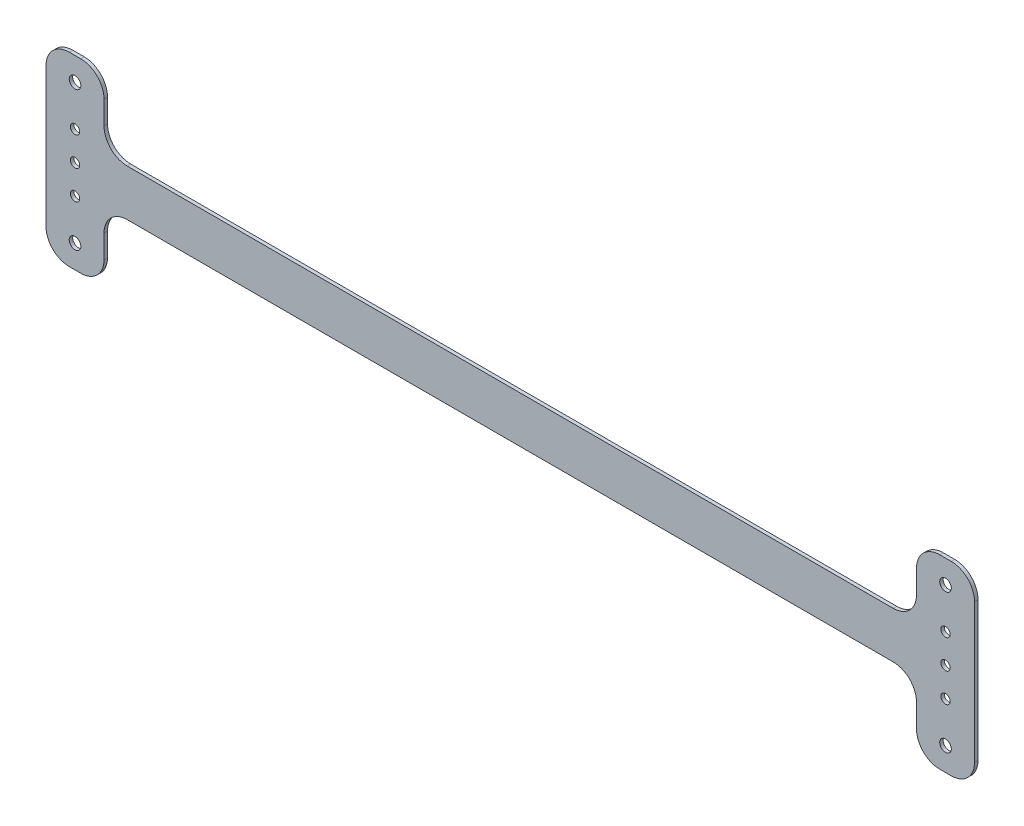
ISO-10303-21;
HEADER;
FILE_DESCRIPTION(('STEP AP214'),'2;1');
FILE_NAME('part.step','',(''),(''),'','','');
FILE_SCHEMA(('AUTOMOTIVE_DESIGN { 1 0 10303 214 1 1 1 1 }'));
ENDSEC;
DATA;
#1=APPLICATION_CONTEXT('core data for automotive mechanical design processes');
#2=APPLICATION_PROTOCOL_DEFINITION('international standard','automotive_design',2000,#1);
#3=PRODUCT_CONTEXT('',#1,'mechanical');
#4=PRODUCT('Part','Part','',(#3));
#5=PRODUCT_RELATED_PRODUCT_CATEGORY('part','',(#4));
#6=PRODUCT_DEFINITION_FORMATION('','',#4);
#7=PRODUCT_DEFINITION_CONTEXT('part definition',#1,'design');
#8=PRODUCT_DEFINITION('design','',#6,#7);
#9=PRODUCT_DEFINITION_SHAPE('','',#8);
#10=(LENGTH_UNIT() NAMED_UNIT(*) SI_UNIT(.MILLI.,.METRE.));
#11=(NAMED_UNIT(*) PLANE_ANGLE_UNIT() SI_UNIT($,.RADIAN.));
#12=(NAMED_UNIT(*) SI_UNIT($,.STERADIAN.) SOLID_ANGLE_UNIT());
#13=UNCERTAINTY_MEASURE_WITH_UNIT(LENGTH_MEASURE(1.E-05),#10,'distance_accuracy_value','');
#14=(GEOMETRIC_REPRESENTATION_CONTEXT(3) GLOBAL_UNCERTAINTY_ASSIGNED_CONTEXT((#13)) GLOBAL_UNIT_ASSIGNED_CONTEXT((#10,
#11,#12)) REPRESENTATION_CONTEXT('',''));
#15=CARTESIAN_POINT('',(0.,0.,0.));
#16=DIRECTION('',(0.,0.,1.));
#17=DIRECTION('',(1.,0.,0.));
#18=AXIS2_PLACEMENT_3D('',#15,#16,#17);
#19=CARTESIAN_POINT('',(0.,0.,3.));
#20=DIRECTION('',(0.,0.,1.));
#21=DIRECTION('',(1.,0.,0.));
#22=AXIS2_PLACEMENT_3D('',#19,#20,#21);
#23=PLANE('',#22);
#24=CARTESIAN_POINT('',(-24.9999999999991,-5.00000000000001,3.));
#25=DIRECTION('',(0.,0.,1.));
#26=DIRECTION('',(1.,0.,0.));
#27=AXIS2_PLACEMENT_3D('',#24,#25,#26);
#28=CIRCLE('',#27,4.00000000000001);
#29=CARTESIAN_POINT('',(-20.9999999999991,-5.00000000000001,3.));
#30=VERTEX_POINT('',#29);
#31=EDGE_CURVE('E460',#30,#30,#28,.T.);
#32=ORIENTED_EDGE('',*,*,#31,.F.);
#33=EDGE_LOOP('',(#32));
#34=FACE_BOUND('',#33,.T.);
#35=CARTESIAN_POINT('',(-24.9999999999991,45.,3.));
#36=DIRECTION('',(0.,0.,1.));
#37=DIRECTION('',(1.,0.,0.));
#38=AXIS2_PLACEMENT_3D('',#35,#36,#37);
#39=CIRCLE('',#38,3.99999999999998);
#40=CARTESIAN_POINT('',(-20.9999999999991,45.,3.));
#41=VERTEX_POINT('',#40);
#42=EDGE_CURVE('E693',#41,#41,#39,.T.);
#43=ORIENTED_EDGE('',*,*,#42,.F.);
#44=EDGE_LOOP('',(#43));
#45=FACE_BOUND('',#44,.T.);
#46=CARTESIAN_POINT('',(724.999999999999,20.0000000000001,3.));
#47=DIRECTION('',(0.,0.,-1.));
#48=DIRECTION('',(-1.,0.,0.));
#49=AXIS2_PLACEMENT_3D('',#46,#47,#48);
#50=CIRCLE('',#49,3.99999999999999);
#51=CARTESIAN_POINT('',(720.999999999999,20.0000000000001,3.));
#52=VERTEX_POINT('',#51);
#53=EDGE_CURVE('E447',#52,#52,#50,.T.);
#54=ORIENTED_EDGE('',*,*,#53,.T.);
#55=EDGE_LOOP('',(#54));
#56=FACE_BOUND('',#55,.T.);
#57=CARTESIAN_POINT('',(725.,80.,3.));
#58=DIRECTION('',(0.,0.,1.));
#59=DIRECTION('',(1.,0.,0.));
#60=AXIS2_PLACEMENT_3D('',#57,#58,#59);
#61=CIRCLE('',#60,5.00000000000005);
#62=CARTESIAN_POINT('',(730.,80.,3.));
#63=VERTEX_POINT('',#62);
#64=EDGE_CURVE('E240',#63,#63,#61,.F.);
#65=ORIENTED_EDGE('',*,*,#64,.T.);
#66=EDGE_LOOP('',(#65));
#67=FACE_BOUND('',#66,.T.);
#68=CARTESIAN_POINT('',(725.,-40.,3.));
#69=DIRECTION('',(0.,0.,1.));
#70=DIRECTION('',(1.,0.,0.));
#71=AXIS2_PLACEMENT_3D('',#68,#69,#70);
#72=CIRCLE('',#71,5.00000000000005);
#73=CARTESIAN_POINT('',(730.,-40.,3.));
#74=VERTEX_POINT('',#73);
#75=EDGE_CURVE('E414',#74,#74,#72,.T.);
#76=ORIENTED_EDGE('',*,*,#75,.F.);
#77=EDGE_LOOP('',(#76));
#78=FACE_BOUND('',#77,.T.);
#79=CARTESIAN_POINT('',(-24.9999999999991,-40.,3.));
#80=DIRECTION('',(0.,0.,1.));
#81=DIRECTION('',(1.,0.,0.));
#82=AXIS2_PLACEMENT_3D('',#79,#80,#81);
#83=CIRCLE('',#82,5.00000000000001);
#84=CARTESIAN_POINT('',(-19.9999999999991,-40.,3.));
#85=VERTEX_POINT('',#84);
#86=EDGE_CURVE('E407',#85,#85,#83,.F.);
#87=ORIENTED_EDGE('',*,*,#86,.T.);
#88=EDGE_LOOP('',(#87));
#89=FACE_BOUND('',#88,.T.);
#90=CARTESIAN_POINT('',(-24.9999999999991,80.,3.));
#91=DIRECTION('',(0.,0.,1.));
#92=DIRECTION('',(1.,0.,0.));
#93=AXIS2_PLACEMENT_3D('',#90,#91,#92);
#94=CIRCLE('',#93,5.00000000000001);
#95=CARTESIAN_POINT('',(-19.9999999999991,80.,3.));
#96=VERTEX_POINT('',#95);
#97=EDGE_CURVE('E401',#96,#96,#94,.T.);
#98=ORIENTED_EDGE('',*,*,#97,.F.);
#99=EDGE_LOOP('',(#98));
#100=FACE_BOUND('',#99,.T.);
#101=DIRECTION('',(0.,-1.,0.));
#102=VECTOR('',#101,1.);
#103=CARTESIAN_POINT('',(700.,9.71445146547012E-13,3.));
#104=LINE('',#103,#102);
#105=CARTESIAN_POINT('',(700.,-20.,3.));
#106=VERTEX_POINT('',#105);
#107=CARTESIAN_POINT('',(700.,-40.,3.));
#108=VERTEX_POINT('',#107);
#109=EDGE_CURVE('E462',#106,#108,#104,.T.);
#110=ORIENTED_EDGE('',*,*,#109,.T.);
#111=CARTESIAN_POINT('',(720.,-40.,3.));
#112=DIRECTION('',(0.,0.,1.));
#113=DIRECTION('',(1.,0.,0.));
#114=AXIS2_PLACEMENT_3D('',#111,#112,#113);
#115=CIRCLE('',#114,20.);
#116=CARTESIAN_POINT('',(720.,-60.,3.));
#117=VERTEX_POINT('',#116);
#118=EDGE_CURVE('E338',#108,#117,#115,.T.);
#119=ORIENTED_EDGE('',*,*,#118,.T.);
#120=DIRECTION('',(1.,0.,0.));
#121=VECTOR('',#120,1.);
#122=CARTESIAN_POINT('',(0.,-60.,3.));
#123=LINE('',#122,#121);
#124=CARTESIAN_POINT('',(730.,-60.,3.));
#125=VERTEX_POINT('',#124);
#126=EDGE_CURVE('E466',#117,#125,#123,.T.);
#127=ORIENTED_EDGE('',*,*,#126,.T.);
#128=CARTESIAN_POINT('',(730.,-40.,3.));
#129=DIRECTION('',(0.,0.,1.));
#130=DIRECTION('',(1.,0.,0.));
#131=AXIS2_PLACEMENT_3D('',#128,#129,#130);
#132=CIRCLE('',#131,20.);
#133=CARTESIAN_POINT('',(750.,-40.,3.));
#134=VERTEX_POINT('',#133);
#135=EDGE_CURVE('E336',#125,#134,#132,.T.);
#136=ORIENTED_EDGE('',*,*,#135,.T.);
#137=DIRECTION('',(0.,-1.,0.));
#138=VECTOR('',#137,1.);
#139=CARTESIAN_POINT('',(750.,-5.20417042793042E-13,3.));
#140=LINE('',#139,#138);
#141=CARTESIAN_POINT('',(750.,80.,3.));
#142=VERTEX_POINT('',#141);
#143=EDGE_CURVE('E469',#142,#134,#140,.T.);
#144=ORIENTED_EDGE('',*,*,#143,.F.);
#145=CARTESIAN_POINT('',(730.,80.,3.));
#146=DIRECTION('',(0.,0.,1.));
#147=DIRECTION('',(1.,0.,0.));
#148=AXIS2_PLACEMENT_3D('',#145,#146,#147);
#149=CIRCLE('',#148,20.);
#150=CARTESIAN_POINT('',(730.,100.,3.));
#151=VERTEX_POINT('',#150);
#152=EDGE_CURVE('E334',#142,#151,#149,.T.);
#153=ORIENTED_EDGE('',*,*,#152,.T.);
#154=DIRECTION('',(1.,0.,0.));
#155=VECTOR('',#154,1.);
#156=CARTESIAN_POINT('',(0.,100.,3.));
#157=LINE('',#156,#155);
#158=CARTESIAN_POINT('',(720.,100.,3.));
#159=VERTEX_POINT('',#158);
#160=EDGE_CURVE('E465',#159,#151,#157,.T.);
#161=ORIENTED_EDGE('',*,*,#160,.F.);
#162=CARTESIAN_POINT('',(720.,80.,3.));
#163=DIRECTION('',(0.,0.,1.));
#164=DIRECTION('',(1.,0.,0.));
#165=AXIS2_PLACEMENT_3D('',#162,#163,#164);
#166=CIRCLE('',#165,20.);
#167=CARTESIAN_POINT('',(700.,80.,3.));
#168=VERTEX_POINT('',#167);
#169=EDGE_CURVE('E332',#159,#168,#166,.T.);
#170=ORIENTED_EDGE('',*,*,#169,.T.);
#171=CARTESIAN_POINT('',(700.,60.,3.));
#172=VERTEX_POINT('',#171);
#173=EDGE_CURVE('E398',#168,#172,#104,.T.);
#174=ORIENTED_EDGE('',*,*,#173,.T.);
#175=CARTESIAN_POINT('',(680.,60.,3.));
#176=DIRECTION('',(0.,0.,1.));
#177=DIRECTION('',(1.,0.,0.));
#178=AXIS2_PLACEMENT_3D('',#175,#176,#177);
#179=CIRCLE('',#178,20.);
#180=CARTESIAN_POINT('',(680.,40.,3.));
#181=VERTEX_POINT('',#180);
#182=EDGE_CURVE('E369',#172,#181,#179,.F.);
#183=ORIENTED_EDGE('',*,*,#182,.T.);
#184=DIRECTION('',(1.,0.,0.));
#185=VECTOR('',#184,1.);
#186=CARTESIAN_POINT('',(0.,40.,3.));
#187=LINE('',#186,#185);
#188=CARTESIAN_POINT('',(20.,40.,3.));
#189=VERTEX_POINT('',#188);
#190=EDGE_CURVE('E388',#189,#181,#187,.T.);
#191=ORIENTED_EDGE('',*,*,#190,.F.);
#192=CARTESIAN_POINT('',(20.,60.,3.));
#193=DIRECTION('',(0.,0.,1.));
#194=DIRECTION('',(1.,0.,0.));
#195=AXIS2_PLACEMENT_3D('',#192,#193,#194);
#196=CIRCLE('',#195,20.);
#197=CARTESIAN_POINT('',(0.,60.,3.));
#198=VERTEX_POINT('',#197);
#199=EDGE_CURVE('E11',#189,#198,#196,.F.);
#200=ORIENTED_EDGE('',*,*,#199,.T.);
#201=DIRECTION('',(0.,-1.,0.));
#202=VECTOR('',#201,1.);
#203=CARTESIAN_POINT('',(0.,0.,3.));
#204=LINE('',#203,#202);
#205=CARTESIAN_POINT('',(0.,80.,3.));
#206=VERTEX_POINT('',#205);
#207=EDGE_CURVE('E386',#206,#198,#204,.T.);
#208=ORIENTED_EDGE('',*,*,#207,.F.);
#209=CARTESIAN_POINT('',(-20.,80.,3.));
#210=DIRECTION('',(0.,0.,1.));
#211=DIRECTION('',(1.,0.,0.));
#212=AXIS2_PLACEMENT_3D('',#209,#210,#211);
#213=CIRCLE('',#212,20.);
#214=CARTESIAN_POINT('',(-20.,100.,3.));
#215=VERTEX_POINT('',#214);
#216=EDGE_CURVE('E325',#206,#215,#213,.T.);
#217=ORIENTED_EDGE('',*,*,#216,.T.);
#218=DIRECTION('',(-1.,0.,0.));
#219=VECTOR('',#218,1.);
#220=CARTESIAN_POINT('',(0.,100.,3.));
#221=LINE('',#220,#219);
#222=CARTESIAN_POINT('',(-29.9999999999993,100.,3.));
#223=VERTEX_POINT('',#222);
#224=EDGE_CURVE('E392',#215,#223,#221,.T.);
#225=ORIENTED_EDGE('',*,*,#224,.T.);
#226=CARTESIAN_POINT('',(-29.9999999999993,80.,3.));
#227=DIRECTION('',(0.,0.,1.));
#228=DIRECTION('',(1.,0.,0.));
#229=AXIS2_PLACEMENT_3D('',#226,#227,#228);
#230=CIRCLE('',#229,20.);
#231=CARTESIAN_POINT('',(-49.9999999999993,80.,3.));
#232=VERTEX_POINT('',#231);
#233=EDGE_CURVE('E327',#223,#232,#230,.T.);
#234=ORIENTED_EDGE('',*,*,#233,.T.);
#235=DIRECTION('',(0.,-1.,0.));
#236=VECTOR('',#235,1.);
#237=CARTESIAN_POINT('',(-49.9999999999993,0.,3.));
#238=LINE('',#237,#236);
#239=CARTESIAN_POINT('',(-49.9999999999992,-40.,3.));
#240=VERTEX_POINT('',#239);
#241=EDGE_CURVE('E396',#232,#240,#238,.T.);
#242=ORIENTED_EDGE('',*,*,#241,.T.);
#243=CARTESIAN_POINT('',(-29.9999999999992,-40.,3.));
#244=DIRECTION('',(0.,0.,1.));
#245=DIRECTION('',(1.,0.,0.));
#246=AXIS2_PLACEMENT_3D('',#243,#244,#245);
#247=CIRCLE('',#246,20.);
#248=CARTESIAN_POINT('',(-29.9999999999992,-60.,3.));
#249=VERTEX_POINT('',#248);
#250=EDGE_CURVE('E53',#240,#249,#247,.T.);
#251=ORIENTED_EDGE('',*,*,#250,.T.);
#252=DIRECTION('',(-1.,0.,0.));
#253=VECTOR('',#252,1.);
#254=CARTESIAN_POINT('',(0.,-60.,3.));
#255=LINE('',#254,#253);
#256=CARTESIAN_POINT('',(-20.,-60.,3.));
#257=VERTEX_POINT('',#256);
#258=EDGE_CURVE('E402',#257,#249,#255,.T.);
#259=ORIENTED_EDGE('',*,*,#258,.F.);
#260=CARTESIAN_POINT('',(-20.,-40.,3.));
#261=DIRECTION('',(0.,0.,1.));
#262=DIRECTION('',(1.,0.,0.));
#263=AXIS2_PLACEMENT_3D('',#260,#261,#262);
#264=CIRCLE('',#263,20.);
#265=CARTESIAN_POINT('',(0.,-40.,3.));
#266=VERTEX_POINT('',#265);
#267=EDGE_CURVE('E329',#257,#266,#264,.T.);
#268=ORIENTED_EDGE('',*,*,#267,.T.);
#269=CARTESIAN_POINT('',(0.,-20.,3.));
#270=VERTEX_POINT('',#269);
#271=EDGE_CURVE('E394',#270,#266,#204,.T.);
#272=ORIENTED_EDGE('',*,*,#271,.F.);
#273=CARTESIAN_POINT('',(20.,-20.,3.));
#274=DIRECTION('',(0.,0.,1.));
#275=DIRECTION('',(1.,0.,0.));
#276=AXIS2_PLACEMENT_3D('',#273,#274,#275);
#277=CIRCLE('',#276,20.);
#278=CARTESIAN_POINT('',(20.,0.,3.));
#279=VERTEX_POINT('',#278);
#280=EDGE_CURVE('E210',#270,#279,#277,.F.);
#281=ORIENTED_EDGE('',*,*,#280,.T.);
#282=DIRECTION('',(1.,0.,0.));
#283=VECTOR('',#282,1.);
#284=CARTESIAN_POINT('',(0.,0.,3.));
#285=LINE('',#284,#283);
#286=CARTESIAN_POINT('',(680.,0.,3.));
#287=VERTEX_POINT('',#286);
#288=EDGE_CURVE('E220',#279,#287,#285,.T.);
#289=ORIENTED_EDGE('',*,*,#288,.T.);
#290=CARTESIAN_POINT('',(680.,-20.,3.));
#291=DIRECTION('',(0.,0.,1.));
#292=DIRECTION('',(1.,0.,0.));
#293=AXIS2_PLACEMENT_3D('',#290,#291,#292);
#294=CIRCLE('',#293,20.);
#295=EDGE_CURVE('E365',#287,#106,#294,.F.);
#296=ORIENTED_EDGE('',*,*,#295,.T.);
#297=EDGE_LOOP('',(#110,#119,#127,#136,#144,#153,#161,#170,#174,#183,#191,#200,#208,#217,#225,
#234,#242,#251,#259,#268,#272,#281,#289,#296));
#298=FACE_BOUND('',#297,.T.);
#299=CARTESIAN_POINT('',(-24.9999999999991,20.,3.));
#300=DIRECTION('',(0.,0.,1.));
#301=DIRECTION('',(1.,0.,0.));
#302=AXIS2_PLACEMENT_3D('',#299,#300,#301);
#303=CIRCLE('',#302,4.00000000000003);
#304=CARTESIAN_POINT('',(-20.9999999999991,20.,3.));
#305=VERTEX_POINT('',#304);
#306=EDGE_CURVE('E237',#305,#305,#303,.T.);
#307=ORIENTED_EDGE('',*,*,#306,.F.);
#308=EDGE_LOOP('',(#307));
#309=FACE_BOUND('',#308,.T.);
#310=CARTESIAN_POINT('',(724.999999999999,-5.,3.));
#311=DIRECTION('',(0.,0.,-1.));
#312=DIRECTION('',(-1.,0.,0.));
#313=AXIS2_PLACEMENT_3D('',#310,#311,#312);
#314=CIRCLE('',#313,3.99999999999999);
#315=CARTESIAN_POINT('',(720.999999999999,-5.,3.));
#316=VERTEX_POINT('',#315);
#317=EDGE_CURVE('E456',#316,#316,#314,.T.);
#318=ORIENTED_EDGE('',*,*,#317,.T.);
#319=EDGE_LOOP('',(#318));
#320=FACE_BOUND('',#319,.T.);
#321=CARTESIAN_POINT('',(724.999999999999,45.,3.));
#322=DIRECTION('',(0.,0.,-1.));
#323=DIRECTION('',(-1.,0.,0.));
#324=AXIS2_PLACEMENT_3D('',#321,#322,#323);
#325=CIRCLE('',#324,3.99999999999988);
#326=CARTESIAN_POINT('',(720.999999999999,45.,3.));
#327=VERTEX_POINT('',#326);
#328=EDGE_CURVE('E446',#327,#327,#325,.T.);
#329=ORIENTED_EDGE('',*,*,#328,.T.);
#330=EDGE_LOOP('',(#329));
#331=FACE_BOUND('',#330,.T.);
#332=ADVANCED_FACE('F38',(#34,#45,#56,#67,#78,#89,#100,#298,#309,#320,#331),#23,.T.);
#333=CARTESIAN_POINT('',(0.,0.,0.));
#334=DIRECTION('',(0.,0.,1.));
#335=DIRECTION('',(1.,0.,0.));
#336=AXIS2_PLACEMENT_3D('',#333,#334,#335);
#337=PLANE('',#336);
#338=CARTESIAN_POINT('',(-24.9999999999991,-5.00000000000001,0.));
#339=DIRECTION('',(0.,0.,1.));
#340=DIRECTION('',(1.,0.,0.));
#341=AXIS2_PLACEMENT_3D('',#338,#339,#340);
#342=CIRCLE('',#341,4.00000000000001);
#343=CARTESIAN_POINT('',(-20.9999999999991,-5.00000000000001,0.));
#344=VERTEX_POINT('',#343);
#345=EDGE_CURVE('E690',#344,#344,#342,.T.);
#346=ORIENTED_EDGE('',*,*,#345,.T.);
#347=EDGE_LOOP('',(#346));
#348=FACE_BOUND('',#347,.T.);
#349=CARTESIAN_POINT('',(-24.9999999999991,45.,0.));
#350=DIRECTION('',(0.,0.,1.));
#351=DIRECTION('',(1.,0.,0.));
#352=AXIS2_PLACEMENT_3D('',#349,#350,#351);
#353=CIRCLE('',#352,3.99999999999998);
#354=CARTESIAN_POINT('',(-20.9999999999991,45.,0.));
#355=VERTEX_POINT('',#354);
#356=EDGE_CURVE('E450',#355,#355,#353,.T.);
#357=ORIENTED_EDGE('',*,*,#356,.T.);
#358=EDGE_LOOP('',(#357));
#359=FACE_BOUND('',#358,.T.);
#360=CARTESIAN_POINT('',(-24.9999999999991,20.,0.));
#361=DIRECTION('',(0.,0.,1.));
#362=DIRECTION('',(1.,0.,0.));
#363=AXIS2_PLACEMENT_3D('',#360,#361,#362);
#364=CIRCLE('',#363,4.00000000000003);
#365=CARTESIAN_POINT('',(-20.9999999999991,20.,0.));
#366=VERTEX_POINT('',#365);
#367=EDGE_CURVE('E230',#366,#366,#364,.T.);
#368=ORIENTED_EDGE('',*,*,#367,.T.);
#369=EDGE_LOOP('',(#368));
#370=FACE_BOUND('',#369,.T.);
#371=DIRECTION('',(1.,0.,0.));
#372=VECTOR('',#371,1.);
#373=CARTESIAN_POINT('',(0.,-60.,0.));
#374=LINE('',#373,#372);
#375=CARTESIAN_POINT('',(720.,-60.,0.));
#376=VERTEX_POINT('',#375);
#377=CARTESIAN_POINT('',(730.,-60.,0.));
#378=VERTEX_POINT('',#377);
#379=EDGE_CURVE('E233',#376,#378,#374,.T.);
#380=ORIENTED_EDGE('',*,*,#379,.F.);
#381=CARTESIAN_POINT('',(720.,-40.,0.));
#382=DIRECTION('',(0.,0.,1.));
#383=DIRECTION('',(1.,0.,0.));
#384=AXIS2_PLACEMENT_3D('',#381,#382,#383);
#385=CIRCLE('',#384,20.);
#386=CARTESIAN_POINT('',(700.,-40.,0.));
#387=VERTEX_POINT('',#386);
#388=EDGE_CURVE('E323',#376,#387,#385,.F.);
#389=ORIENTED_EDGE('',*,*,#388,.T.);
#390=DIRECTION('',(0.,-1.,0.));
#391=VECTOR('',#390,1.);
#392=CARTESIAN_POINT('',(700.,9.71445146547012E-13,0.));
#393=LINE('',#392,#391);
#394=CARTESIAN_POINT('',(700.,-20.,0.));
#395=VERTEX_POINT('',#394);
#396=EDGE_CURVE('E229',#395,#387,#393,.T.);
#397=ORIENTED_EDGE('',*,*,#396,.F.);
#398=CARTESIAN_POINT('',(680.,-20.,0.));
#399=DIRECTION('',(0.,0.,1.));
#400=DIRECTION('',(1.,0.,0.));
#401=AXIS2_PLACEMENT_3D('',#398,#399,#400);
#402=CIRCLE('',#401,20.);
#403=CARTESIAN_POINT('',(680.,0.,0.));
#404=VERTEX_POINT('',#403);
#405=EDGE_CURVE('E228',#395,#404,#402,.T.);
#406=ORIENTED_EDGE('',*,*,#405,.T.);
#407=DIRECTION('',(1.,0.,0.));
#408=VECTOR('',#407,1.);
#409=CARTESIAN_POINT('',(0.,0.,0.));
#410=LINE('',#409,#408);
#411=CARTESIAN_POINT('',(20.,0.,0.));
#412=VERTEX_POINT('',#411);
#413=EDGE_CURVE('E217',#412,#404,#410,.T.);
#414=ORIENTED_EDGE('',*,*,#413,.F.);
#415=CARTESIAN_POINT('',(20.,-20.,0.));
#416=DIRECTION('',(0.,0.,1.));
#417=DIRECTION('',(1.,0.,0.));
#418=AXIS2_PLACEMENT_3D('',#415,#416,#417);
#419=CIRCLE('',#418,20.);
#420=CARTESIAN_POINT('',(0.,-20.,0.));
#421=VERTEX_POINT('',#420);
#422=EDGE_CURVE('E200',#412,#421,#419,.T.);
#423=ORIENTED_EDGE('',*,*,#422,.T.);
#424=DIRECTION('',(0.,-1.,0.));
#425=VECTOR('',#424,1.);
#426=CARTESIAN_POINT('',(0.,0.,0.));
#427=LINE('',#426,#425);
#428=CARTESIAN_POINT('',(0.,-40.,0.));
#429=VERTEX_POINT('',#428);
#430=EDGE_CURVE('E259',#421,#429,#427,.T.);
#431=ORIENTED_EDGE('',*,*,#430,.T.);
#432=CARTESIAN_POINT('',(-20.,-40.,0.));
#433=DIRECTION('',(0.,0.,1.));
#434=DIRECTION('',(1.,0.,0.));
#435=AXIS2_PLACEMENT_3D('',#432,#433,#434);
#436=CIRCLE('',#435,20.);
#437=CARTESIAN_POINT('',(-20.,-60.,0.));
#438=VERTEX_POINT('',#437);
#439=EDGE_CURVE('E313',#429,#438,#436,.F.);
#440=ORIENTED_EDGE('',*,*,#439,.T.);
#441=DIRECTION('',(-1.,0.,0.));
#442=VECTOR('',#441,1.);
#443=CARTESIAN_POINT('',(0.,-60.,0.));
#444=LINE('',#443,#442);
#445=CARTESIAN_POINT('',(-29.9999999999992,-60.,0.));
#446=VERTEX_POINT('',#445);
#447=EDGE_CURVE('E265',#438,#446,#444,.T.);
#448=ORIENTED_EDGE('',*,*,#447,.T.);
#449=CARTESIAN_POINT('',(-29.9999999999992,-40.,0.));
#450=DIRECTION('',(0.,0.,1.));
#451=DIRECTION('',(1.,0.,0.));
#452=AXIS2_PLACEMENT_3D('',#449,#450,#451);
#453=CIRCLE('',#452,20.);
#454=CARTESIAN_POINT('',(-49.9999999999992,-40.,0.));
#455=VERTEX_POINT('',#454);
#456=EDGE_CURVE('E315',#446,#455,#453,.F.);
#457=ORIENTED_EDGE('',*,*,#456,.T.);
#458=DIRECTION('',(0.,-1.,0.));
#459=VECTOR('',#458,1.);
#460=CARTESIAN_POINT('',(-49.9999999999993,0.,0.));
#461=LINE('',#460,#459);
#462=CARTESIAN_POINT('',(-49.9999999999993,80.,0.));
#463=VERTEX_POINT('',#462);
#464=EDGE_CURVE('E262',#463,#455,#461,.T.);
#465=ORIENTED_EDGE('',*,*,#464,.F.);
#466=CARTESIAN_POINT('',(-29.9999999999993,80.,0.));
#467=DIRECTION('',(0.,0.,1.));
#468=DIRECTION('',(1.,0.,0.));
#469=AXIS2_PLACEMENT_3D('',#466,#467,#468);
#470=CIRCLE('',#469,20.);
#471=CARTESIAN_POINT('',(-29.9999999999993,100.,0.));
#472=VERTEX_POINT('',#471);
#473=EDGE_CURVE('E311',#463,#472,#470,.F.);
#474=ORIENTED_EDGE('',*,*,#473,.T.);
#475=DIRECTION('',(-1.,0.,0.));
#476=VECTOR('',#475,1.);
#477=CARTESIAN_POINT('',(0.,100.,0.));
#478=LINE('',#477,#476);
#479=CARTESIAN_POINT('',(-20.,100.,0.));
#480=VERTEX_POINT('',#479);
#481=EDGE_CURVE('E258',#480,#472,#478,.T.);
#482=ORIENTED_EDGE('',*,*,#481,.F.);
#483=CARTESIAN_POINT('',(-20.,80.,0.));
#484=DIRECTION('',(0.,0.,1.));
#485=DIRECTION('',(1.,0.,0.));
#486=AXIS2_PLACEMENT_3D('',#483,#484,#485);
#487=CIRCLE('',#486,20.);
#488=CARTESIAN_POINT('',(0.,80.,0.));
#489=VERTEX_POINT('',#488);
#490=EDGE_CURVE('E309',#480,#489,#487,.F.);
#491=ORIENTED_EDGE('',*,*,#490,.T.);
#492=CARTESIAN_POINT('',(0.,60.,0.));
#493=VERTEX_POINT('',#492);
#494=EDGE_CURVE('E255',#489,#493,#427,.T.);
#495=ORIENTED_EDGE('',*,*,#494,.T.);
#496=CARTESIAN_POINT('',(20.,60.,0.));
#497=DIRECTION('',(0.,0.,1.));
#498=DIRECTION('',(1.,0.,0.));
#499=AXIS2_PLACEMENT_3D('',#496,#497,#498);
#500=CIRCLE('',#499,20.);
#501=CARTESIAN_POINT('',(20.,40.,0.));
#502=VERTEX_POINT('',#501);
#503=EDGE_CURVE('E46',#493,#502,#500,.T.);
#504=ORIENTED_EDGE('',*,*,#503,.T.);
#505=DIRECTION('',(1.,0.,0.));
#506=VECTOR('',#505,1.);
#507=CARTESIAN_POINT('',(0.,40.,0.));
#508=LINE('',#507,#506);
#509=CARTESIAN_POINT('',(680.,40.,0.));
#510=VERTEX_POINT('',#509);
#511=EDGE_CURVE('E244',#502,#510,#508,.T.);
#512=ORIENTED_EDGE('',*,*,#511,.T.);
#513=CARTESIAN_POINT('',(680.,60.,0.));
#514=DIRECTION('',(0.,0.,1.));
#515=DIRECTION('',(1.,0.,0.));
#516=AXIS2_PLACEMENT_3D('',#513,#514,#515);
#517=CIRCLE('',#516,20.);
#518=CARTESIAN_POINT('',(700.,60.,0.));
#519=VERTEX_POINT('',#518);
#520=EDGE_CURVE('E367',#510,#519,#517,.T.);
#521=ORIENTED_EDGE('',*,*,#520,.T.);
#522=CARTESIAN_POINT('',(700.,80.,0.));
#523=VERTEX_POINT('',#522);
#524=EDGE_CURVE('E235',#523,#519,#393,.T.);
#525=ORIENTED_EDGE('',*,*,#524,.F.);
#526=CARTESIAN_POINT('',(720.,80.,0.));
#527=DIRECTION('',(0.,0.,1.));
#528=DIRECTION('',(1.,0.,0.));
#529=AXIS2_PLACEMENT_3D('',#526,#527,#528);
#530=CIRCLE('',#529,20.);
#531=CARTESIAN_POINT('',(720.,100.,0.));
#532=VERTEX_POINT('',#531);
#533=EDGE_CURVE('E317',#523,#532,#530,.F.);
#534=ORIENTED_EDGE('',*,*,#533,.T.);
#535=DIRECTION('',(1.,0.,0.));
#536=VECTOR('',#535,1.);
#537=CARTESIAN_POINT('',(0.,100.,0.));
#538=LINE('',#537,#536);
#539=CARTESIAN_POINT('',(730.,100.,0.));
#540=VERTEX_POINT('',#539);
#541=EDGE_CURVE('E245',#532,#540,#538,.T.);
#542=ORIENTED_EDGE('',*,*,#541,.T.);
#543=CARTESIAN_POINT('',(730.,80.,0.));
#544=DIRECTION('',(0.,0.,1.));
#545=DIRECTION('',(1.,0.,0.));
#546=AXIS2_PLACEMENT_3D('',#543,#544,#545);
#547=CIRCLE('',#546,20.);
#548=CARTESIAN_POINT('',(750.,80.,0.));
#549=VERTEX_POINT('',#548);
#550=EDGE_CURVE('E319',#540,#549,#547,.F.);
#551=ORIENTED_EDGE('',*,*,#550,.T.);
#552=DIRECTION('',(0.,-1.,0.));
#553=VECTOR('',#552,1.);
#554=CARTESIAN_POINT('',(750.,-5.20417042793042E-13,0.));
#555=LINE('',#554,#553);
#556=CARTESIAN_POINT('',(750.,-40.,0.));
#557=VERTEX_POINT('',#556);
#558=EDGE_CURVE('E248',#549,#557,#555,.T.);
#559=ORIENTED_EDGE('',*,*,#558,.T.);
#560=CARTESIAN_POINT('',(730.,-40.,0.));
#561=DIRECTION('',(0.,0.,1.));
#562=DIRECTION('',(1.,0.,0.));
#563=AXIS2_PLACEMENT_3D('',#560,#561,#562);
#564=CIRCLE('',#563,20.);
#565=EDGE_CURVE('E321',#557,#378,#564,.F.);
#566=ORIENTED_EDGE('',*,*,#565,.T.);
#567=EDGE_LOOP('',(#380,#389,#397,#406,#414,#423,#431,#440,#448,#457,#465,#474,#482,#491,#495,
#504,#512,#521,#525,#534,#542,#551,#559,#566));
#568=FACE_BOUND('',#567,.T.);
#569=CARTESIAN_POINT('',(-24.9999999999991,80.,0.));
#570=DIRECTION('',(0.,0.,1.));
#571=DIRECTION('',(1.,0.,0.));
#572=AXIS2_PLACEMENT_3D('',#569,#570,#571);
#573=CIRCLE('',#572,5.00000000000001);
#574=CARTESIAN_POINT('',(-19.9999999999991,80.,0.));
#575=VERTEX_POINT('',#574);
#576=EDGE_CURVE('E268',#575,#575,#573,.T.);
#577=ORIENTED_EDGE('',*,*,#576,.T.);
#578=EDGE_LOOP('',(#577));
#579=FACE_BOUND('',#578,.T.);
#580=CARTESIAN_POINT('',(-24.9999999999991,-40.,0.));
#581=DIRECTION('',(0.,0.,1.));
#582=DIRECTION('',(1.,0.,0.));
#583=AXIS2_PLACEMENT_3D('',#580,#581,#582);
#584=CIRCLE('',#583,5.00000000000001);
#585=CARTESIAN_POINT('',(-19.9999999999991,-40.,0.));
#586=VERTEX_POINT('',#585);
#587=EDGE_CURVE('E271',#586,#586,#584,.F.);
#588=ORIENTED_EDGE('',*,*,#587,.F.);
#589=EDGE_LOOP('',(#588));
#590=FACE_BOUND('',#589,.T.);
#591=CARTESIAN_POINT('',(725.,-40.,0.));
#592=DIRECTION('',(0.,0.,1.));
#593=DIRECTION('',(1.,0.,0.));
#594=AXIS2_PLACEMENT_3D('',#591,#592,#593);
#595=CIRCLE('',#594,5.00000000000005);
#596=CARTESIAN_POINT('',(730.,-40.,0.));
#597=VERTEX_POINT('',#596);
#598=EDGE_CURVE('E274',#597,#597,#595,.T.);
#599=ORIENTED_EDGE('',*,*,#598,.T.);
#600=EDGE_LOOP('',(#599));
#601=FACE_BOUND('',#600,.T.);
#602=CARTESIAN_POINT('',(725.,80.,0.));
#603=DIRECTION('',(0.,0.,1.));
#604=DIRECTION('',(1.,0.,0.));
#605=AXIS2_PLACEMENT_3D('',#602,#603,#604);
#606=CIRCLE('',#605,5.00000000000005);
#607=CARTESIAN_POINT('',(730.,80.,0.));
#608=VERTEX_POINT('',#607);
#609=EDGE_CURVE('E277',#608,#608,#606,.F.);
#610=ORIENTED_EDGE('',*,*,#609,.F.);
#611=EDGE_LOOP('',(#610));
#612=FACE_BOUND('',#611,.T.);
#613=CARTESIAN_POINT('',(724.999999999999,-5.,0.));
#614=DIRECTION('',(0.,0.,-1.));
#615=DIRECTION('',(-1.,0.,0.));
#616=AXIS2_PLACEMENT_3D('',#613,#614,#615);
#617=CIRCLE('',#616,3.99999999999999);
#618=CARTESIAN_POINT('',(720.999999999999,-5.,0.));
#619=VERTEX_POINT('',#618);
#620=EDGE_CURVE('E437',#619,#619,#617,.T.);
#621=ORIENTED_EDGE('',*,*,#620,.F.);
#622=EDGE_LOOP('',(#621));
#623=FACE_BOUND('',#622,.T.);
#624=CARTESIAN_POINT('',(724.999999999999,20.0000000000001,0.));
#625=DIRECTION('',(0.,0.,-1.));
#626=DIRECTION('',(-1.,0.,0.));
#627=AXIS2_PLACEMENT_3D('',#624,#625,#626);
#628=CIRCLE('',#627,3.99999999999999);
#629=CARTESIAN_POINT('',(720.999999999999,20.0000000000001,0.));
#630=VERTEX_POINT('',#629);
#631=EDGE_CURVE('E441',#630,#630,#628,.T.);
#632=ORIENTED_EDGE('',*,*,#631,.F.);
#633=EDGE_LOOP('',(#632));
#634=FACE_BOUND('',#633,.T.);
#635=CARTESIAN_POINT('',(724.999999999999,45.,0.));
#636=DIRECTION('',(0.,0.,-1.));
#637=DIRECTION('',(-1.,0.,0.));
#638=AXIS2_PLACEMENT_3D('',#635,#636,#637);
#639=CIRCLE('',#638,3.99999999999988);
#640=CARTESIAN_POINT('',(720.999999999999,45.,0.));
#641=VERTEX_POINT('',#640);
#642=EDGE_CURVE('E444',#641,#641,#639,.T.);
#643=ORIENTED_EDGE('',*,*,#642,.F.);
#644=EDGE_LOOP('',(#643));
#645=FACE_BOUND('',#644,.T.);
#646=ADVANCED_FACE('F225',(#348,#359,#370,#568,#579,#590,#601,#612,#623,#634,#645),#337,.F.);
#647=CARTESIAN_POINT('',(0.,0.,3.));
#648=DIRECTION('',(0.,1.,0.));
#649=DIRECTION('',(-1.,0.,0.));
#650=AXIS2_PLACEMENT_3D('',#647,#648,#649);
#651=PLANE('',#650);
#652=ORIENTED_EDGE('',*,*,#288,.F.);
#653=DIRECTION('',(0.,0.,-1.));
#654=VECTOR('',#653,1.);
#655=CARTESIAN_POINT('',(20.,0.,3.));
#656=LINE('',#655,#654);
#657=EDGE_CURVE('E204',#279,#412,#656,.T.);
#658=ORIENTED_EDGE('',*,*,#657,.T.);
#659=ORIENTED_EDGE('',*,*,#413,.T.);
#660=DIRECTION('',(0.,0.,-1.));
#661=VECTOR('',#660,1.);
#662=CARTESIAN_POINT('',(680.,0.,3.));
#663=LINE('',#662,#661);
#664=EDGE_CURVE('E222',#404,#287,#663,.F.);
#665=ORIENTED_EDGE('',*,*,#664,.T.);
#666=EDGE_LOOP('',(#652,#658,#659,#665));
#667=FACE_BOUND('',#666,.T.);
#668=ADVANCED_FACE('F216',(#667),#651,.F.);
#669=CARTESIAN_POINT('',(700.,9.71445146547012E-13,3.));
#670=DIRECTION('',(1.,0.,0.));
#671=DIRECTION('',(0.,1.,0.));
#672=AXIS2_PLACEMENT_3D('',#669,#670,#671);
#673=PLANE('',#672);
#674=ORIENTED_EDGE('',*,*,#109,.F.);
#675=DIRECTION('',(0.,0.,-1.));
#676=VECTOR('',#675,1.);
#677=CARTESIAN_POINT('',(700.,-20.,0.));
#678=LINE('',#677,#676);
#679=EDGE_CURVE('E286',#106,#395,#678,.T.);
#680=ORIENTED_EDGE('',*,*,#679,.T.);
#681=ORIENTED_EDGE('',*,*,#396,.T.);
#682=DIRECTION('',(0.,0.,-1.));
#683=VECTOR('',#682,1.);
#684=CARTESIAN_POINT('',(700.,-40.,3.));
#685=LINE('',#684,#683);
#686=EDGE_CURVE('E284',#387,#108,#685,.F.);
#687=ORIENTED_EDGE('',*,*,#686,.T.);
#688=EDGE_LOOP('',(#674,#680,#681,#687));
#689=FACE_BOUND('',#688,.T.);
#690=ADVANCED_FACE('F503',(#689),#673,.F.);
#691=CARTESIAN_POINT('',(0.,-60.,3.));
#692=DIRECTION('',(0.,1.,0.));
#693=DIRECTION('',(0.,0.,1.));
#694=AXIS2_PLACEMENT_3D('',#691,#692,#693);
#695=PLANE('',#694);
#696=ORIENTED_EDGE('',*,*,#126,.F.);
#697=DIRECTION('',(0.,0.,-1.));
#698=VECTOR('',#697,1.);
#699=CARTESIAN_POINT('',(720.,-60.,3.));
#700=LINE('',#699,#698);
#701=EDGE_CURVE('E306',#117,#376,#700,.T.);
#702=ORIENTED_EDGE('',*,*,#701,.T.);
#703=ORIENTED_EDGE('',*,*,#379,.T.);
#704=DIRECTION('',(0.,0.,-1.));
#705=VECTOR('',#704,1.);
#706=CARTESIAN_POINT('',(730.,-60.,3.));
#707=LINE('',#706,#705);
#708=EDGE_CURVE('E304',#378,#125,#707,.F.);
#709=ORIENTED_EDGE('',*,*,#708,.T.);
#710=EDGE_LOOP('',(#696,#702,#703,#709));
#711=FACE_BOUND('',#710,.T.);
#712=ADVANCED_FACE('F495',(#711),#695,.F.);
#713=CARTESIAN_POINT('',(750.,-5.20417042793042E-13,3.));
#714=DIRECTION('',(1.,0.,0.));
#715=DIRECTION('',(0.,1.,0.));
#716=AXIS2_PLACEMENT_3D('',#713,#714,#715);
#717=PLANE('',#716);
#718=ORIENTED_EDGE('',*,*,#143,.T.);
#719=DIRECTION('',(0.,0.,-1.));
#720=VECTOR('',#719,1.);
#721=CARTESIAN_POINT('',(750.,-40.,0.));
#722=LINE('',#721,#720);
#723=EDGE_CURVE('E342',#134,#557,#722,.T.);
#724=ORIENTED_EDGE('',*,*,#723,.T.);
#725=ORIENTED_EDGE('',*,*,#558,.F.);
#726=DIRECTION('',(0.,0.,-1.));
#727=VECTOR('',#726,1.);
#728=CARTESIAN_POINT('',(750.,80.,3.));
#729=LINE('',#728,#727);
#730=EDGE_CURVE('E340',#549,#142,#729,.F.);
#731=ORIENTED_EDGE('',*,*,#730,.T.);
#732=EDGE_LOOP('',(#718,#724,#725,#731));
#733=FACE_BOUND('',#732,.T.);
#734=ADVANCED_FACE('F486',(#733),#717,.T.);
#735=CARTESIAN_POINT('',(0.,100.,3.));
#736=DIRECTION('',(0.,1.,0.));
#737=DIRECTION('',(0.,0.,1.));
#738=AXIS2_PLACEMENT_3D('',#735,#736,#737);
#739=PLANE('',#738);
#740=ORIENTED_EDGE('',*,*,#160,.T.);
#741=DIRECTION('',(0.,0.,-1.));
#742=VECTOR('',#741,1.);
#743=CARTESIAN_POINT('',(730.,100.,3.));
#744=LINE('',#743,#742);
#745=EDGE_CURVE('E347',#151,#540,#744,.T.);
#746=ORIENTED_EDGE('',*,*,#745,.T.);
#747=ORIENTED_EDGE('',*,*,#541,.F.);
#748=DIRECTION('',(0.,0.,-1.));
#749=VECTOR('',#748,1.);
#750=CARTESIAN_POINT('',(720.,100.,3.));
#751=LINE('',#750,#749);
#752=EDGE_CURVE('E345',#532,#159,#751,.F.);
#753=ORIENTED_EDGE('',*,*,#752,.T.);
#754=EDGE_LOOP('',(#740,#746,#747,#753));
#755=FACE_BOUND('',#754,.T.);
#756=ADVANCED_FACE('F476',(#755),#739,.T.);
#757=ORIENTED_EDGE('',*,*,#524,.T.);
#758=DIRECTION('',(0.,0.,-1.));
#759=VECTOR('',#758,1.);
#760=CARTESIAN_POINT('',(700.,60.,3.));
#761=LINE('',#760,#759);
#762=EDGE_CURVE('E297',#519,#172,#761,.F.);
#763=ORIENTED_EDGE('',*,*,#762,.T.);
#764=ORIENTED_EDGE('',*,*,#173,.F.);
#765=DIRECTION('',(0.,0.,-1.));
#766=VECTOR('',#765,1.);
#767=CARTESIAN_POINT('',(700.,80.,0.));
#768=LINE('',#767,#766);
#769=EDGE_CURVE('E294',#168,#523,#768,.T.);
#770=ORIENTED_EDGE('',*,*,#769,.T.);
#771=EDGE_LOOP('',(#757,#763,#764,#770));
#772=FACE_BOUND('',#771,.T.);
#773=ADVANCED_FACE('F569',(#772),#673,.F.);
#774=CARTESIAN_POINT('',(0.,40.,3.));
#775=DIRECTION('',(0.,1.,0.));
#776=DIRECTION('',(0.,0.,1.));
#777=AXIS2_PLACEMENT_3D('',#774,#775,#776);
#778=PLANE('',#777);
#779=ORIENTED_EDGE('',*,*,#190,.T.);
#780=DIRECTION('',(0.,0.,-1.));
#781=VECTOR('',#780,1.);
#782=CARTESIAN_POINT('',(680.,40.,3.));
#783=LINE('',#782,#781);
#784=EDGE_CURVE('E291',#181,#510,#783,.T.);
#785=ORIENTED_EDGE('',*,*,#784,.T.);
#786=ORIENTED_EDGE('',*,*,#511,.F.);
#787=DIRECTION('',(0.,0.,-1.));
#788=VECTOR('',#787,1.);
#789=CARTESIAN_POINT('',(20.,40.,3.));
#790=LINE('',#789,#788);
#791=EDGE_CURVE('E289',#502,#189,#790,.F.);
#792=ORIENTED_EDGE('',*,*,#791,.T.);
#793=EDGE_LOOP('',(#779,#785,#786,#792));
#794=FACE_BOUND('',#793,.T.);
#795=ADVANCED_FACE('F377',(#794),#778,.T.);
#796=CARTESIAN_POINT('',(0.,0.,3.));
#797=DIRECTION('',(1.,0.,0.));
#798=DIRECTION('',(0.,1.,0.));
#799=AXIS2_PLACEMENT_3D('',#796,#797,#798);
#800=PLANE('',#799);
#801=ORIENTED_EDGE('',*,*,#207,.T.);
#802=DIRECTION('',(0.,0.,-1.));
#803=VECTOR('',#802,1.);
#804=CARTESIAN_POINT('',(0.,60.,0.));
#805=LINE('',#804,#803);
#806=EDGE_CURVE('E301',#198,#493,#805,.T.);
#807=ORIENTED_EDGE('',*,*,#806,.T.);
#808=ORIENTED_EDGE('',*,*,#494,.F.);
#809=DIRECTION('',(0.,0.,-1.));
#810=VECTOR('',#809,1.);
#811=CARTESIAN_POINT('',(0.,80.,3.));
#812=LINE('',#811,#810);
#813=EDGE_CURVE('E299',#489,#206,#812,.F.);
#814=ORIENTED_EDGE('',*,*,#813,.T.);
#815=EDGE_LOOP('',(#801,#807,#808,#814));
#816=FACE_BOUND('',#815,.T.);
#817=ADVANCED_FACE('F390',(#816),#800,.T.);
#818=CARTESIAN_POINT('',(0.,100.,3.));
#819=DIRECTION('',(0.,-1.,0.));
#820=DIRECTION('',(0.,0.,-1.));
#821=AXIS2_PLACEMENT_3D('',#818,#819,#820);
#822=PLANE('',#821);
#823=ORIENTED_EDGE('',*,*,#481,.T.);
#824=DIRECTION('',(0.,0.,-1.));
#825=VECTOR('',#824,1.);
#826=CARTESIAN_POINT('',(-29.9999999999993,100.,3.));
#827=LINE('',#826,#825);
#828=EDGE_CURVE('E211',#472,#223,#827,.F.);
#829=ORIENTED_EDGE('',*,*,#828,.T.);
#830=ORIENTED_EDGE('',*,*,#224,.F.);
#831=DIRECTION('',(0.,0.,-1.));
#832=VECTOR('',#831,1.);
#833=CARTESIAN_POINT('',(-20.,100.,0.));
#834=LINE('',#833,#832);
#835=EDGE_CURVE('E359',#215,#480,#834,.T.);
#836=ORIENTED_EDGE('',*,*,#835,.T.);
#837=EDGE_LOOP('',(#823,#829,#830,#836));
#838=FACE_BOUND('',#837,.T.);
#839=ADVANCED_FACE('F526',(#838),#822,.F.);
#840=CARTESIAN_POINT('',(-49.9999999999993,0.,3.));
#841=DIRECTION('',(1.,0.,0.));
#842=DIRECTION('',(0.,1.,0.));
#843=AXIS2_PLACEMENT_3D('',#840,#841,#842);
#844=PLANE('',#843);
#845=ORIENTED_EDGE('',*,*,#464,.T.);
#846=DIRECTION('',(0.,0.,-1.));
#847=VECTOR('',#846,1.);
#848=CARTESIAN_POINT('',(-49.9999999999992,-40.,3.));
#849=LINE('',#848,#847);
#850=EDGE_CURVE('E357',#455,#240,#849,.F.);
#851=ORIENTED_EDGE('',*,*,#850,.T.);
#852=ORIENTED_EDGE('',*,*,#241,.F.);
#853=DIRECTION('',(0.,0.,-1.));
#854=VECTOR('',#853,1.);
#855=CARTESIAN_POINT('',(-49.9999999999993,80.,3.));
#856=LINE('',#855,#854);
#857=EDGE_CURVE('E354',#232,#463,#856,.T.);
#858=ORIENTED_EDGE('',*,*,#857,.T.);
#859=EDGE_LOOP('',(#845,#851,#852,#858));
#860=FACE_BOUND('',#859,.T.);
#861=ADVANCED_FACE('F517',(#860),#844,.F.);
#862=CARTESIAN_POINT('',(0.,-60.,3.));
#863=DIRECTION('',(0.,-1.,0.));
#864=DIRECTION('',(0.,0.,-1.));
#865=AXIS2_PLACEMENT_3D('',#862,#863,#864);
#866=PLANE('',#865);
#867=ORIENTED_EDGE('',*,*,#258,.T.);
#868=DIRECTION('',(0.,0.,-1.));
#869=VECTOR('',#868,1.);
#870=CARTESIAN_POINT('',(-29.9999999999992,-60.,0.));
#871=LINE('',#870,#869);
#872=EDGE_CURVE('E351',#249,#446,#871,.T.);
#873=ORIENTED_EDGE('',*,*,#872,.T.);
#874=ORIENTED_EDGE('',*,*,#447,.F.);
#875=DIRECTION('',(0.,0.,-1.));
#876=VECTOR('',#875,1.);
#877=CARTESIAN_POINT('',(-20.,-60.,3.));
#878=LINE('',#877,#876);
#879=EDGE_CURVE('E60',#438,#257,#878,.F.);
#880=ORIENTED_EDGE('',*,*,#879,.T.);
#881=EDGE_LOOP('',(#867,#873,#874,#880));
#882=FACE_BOUND('',#881,.T.);
#883=ADVANCED_FACE('F511',(#882),#866,.T.);
#884=CARTESIAN_POINT('',(725.,-40.,3.));
#885=DIRECTION('',(0.,0.,-1.));
#886=DIRECTION('',(-1.,0.,0.));
#887=AXIS2_PLACEMENT_3D('',#884,#885,#886);
#888=CYLINDRICAL_SURFACE('',#887,5.00000000000005);
#889=ORIENTED_EDGE('',*,*,#75,.T.);
#890=EDGE_LOOP('',(#889));
#891=FACE_BOUND('',#890,.T.);
#892=ORIENTED_EDGE('',*,*,#598,.F.);
#893=EDGE_LOOP('',(#892));
#894=FACE_BOUND('',#893,.T.);
#895=ADVANCED_FACE('F548',(#891,#894),#888,.F.);
#896=CARTESIAN_POINT('',(-24.9999999999991,-40.,3.));
#897=DIRECTION('',(0.,0.,-1.));
#898=DIRECTION('',(-1.,0.,0.));
#899=AXIS2_PLACEMENT_3D('',#896,#897,#898);
#900=CYLINDRICAL_SURFACE('',#899,5.00000000000001);
#901=ORIENTED_EDGE('',*,*,#86,.F.);
#902=EDGE_LOOP('',(#901));
#903=FACE_BOUND('',#902,.T.);
#904=ORIENTED_EDGE('',*,*,#587,.T.);
#905=EDGE_LOOP('',(#904));
#906=FACE_BOUND('',#905,.T.);
#907=ADVANCED_FACE('F551',(#903,#906),#900,.F.);
#908=CARTESIAN_POINT('',(-24.9999999999991,80.,3.));
#909=DIRECTION('',(0.,0.,-1.));
#910=DIRECTION('',(-1.,0.,0.));
#911=AXIS2_PLACEMENT_3D('',#908,#909,#910);
#912=CYLINDRICAL_SURFACE('',#911,5.00000000000001);
#913=ORIENTED_EDGE('',*,*,#97,.T.);
#914=EDGE_LOOP('',(#913));
#915=FACE_BOUND('',#914,.T.);
#916=ORIENTED_EDGE('',*,*,#576,.F.);
#917=EDGE_LOOP('',(#916));
#918=FACE_BOUND('',#917,.T.);
#919=ADVANCED_FACE('F554',(#915,#918),#912,.F.);
#920=ORIENTED_EDGE('',*,*,#430,.F.);
#921=DIRECTION('',(0.,0.,-1.));
#922=VECTOR('',#921,1.);
#923=CARTESIAN_POINT('',(0.,-20.,3.));
#924=LINE('',#923,#922);
#925=EDGE_CURVE('E205',#421,#270,#924,.F.);
#926=ORIENTED_EDGE('',*,*,#925,.T.);
#927=ORIENTED_EDGE('',*,*,#271,.T.);
#928=DIRECTION('',(0.,0.,-1.));
#929=VECTOR('',#928,1.);
#930=CARTESIAN_POINT('',(0.,-40.,3.));
#931=LINE('',#930,#929);
#932=EDGE_CURVE('E221',#266,#429,#931,.T.);
#933=ORIENTED_EDGE('',*,*,#932,.T.);
#934=EDGE_LOOP('',(#920,#926,#927,#933));
#935=FACE_BOUND('',#934,.T.);
#936=ADVANCED_FACE('F426',(#935),#800,.T.);
#937=CARTESIAN_POINT('',(725.,80.,3.));
#938=DIRECTION('',(0.,0.,-1.));
#939=DIRECTION('',(-1.,0.,0.));
#940=AXIS2_PLACEMENT_3D('',#937,#938,#939);
#941=CYLINDRICAL_SURFACE('',#940,5.00000000000005);
#942=ORIENTED_EDGE('',*,*,#64,.F.);
#943=EDGE_LOOP('',(#942));
#944=FACE_BOUND('',#943,.T.);
#945=ORIENTED_EDGE('',*,*,#609,.T.);
#946=EDGE_LOOP('',(#945));
#947=FACE_BOUND('',#946,.T.);
#948=ADVANCED_FACE('F423',(#944,#947),#941,.F.);
#949=CARTESIAN_POINT('',(20.,-20.,3.));
#950=DIRECTION('',(0.,0.,-1.));
#951=DIRECTION('',(-1.,0.,0.));
#952=AXIS2_PLACEMENT_3D('',#949,#950,#951);
#953=CYLINDRICAL_SURFACE('',#952,20.);
#954=ORIENTED_EDGE('',*,*,#280,.F.);
#955=ORIENTED_EDGE('',*,*,#925,.F.);
#956=ORIENTED_EDGE('',*,*,#422,.F.);
#957=ORIENTED_EDGE('',*,*,#657,.F.);
#958=EDGE_LOOP('',(#954,#955,#956,#957));
#959=FACE_BOUND('',#958,.T.);
#960=ADVANCED_FACE('F203',(#959),#953,.F.);
#961=CARTESIAN_POINT('',(680.,-20.,3.));
#962=DIRECTION('',(0.,0.,1.));
#963=DIRECTION('',(1.,0.,0.));
#964=AXIS2_PLACEMENT_3D('',#961,#962,#963);
#965=CYLINDRICAL_SURFACE('',#964,20.);
#966=ORIENTED_EDGE('',*,*,#295,.F.);
#967=ORIENTED_EDGE('',*,*,#664,.F.);
#968=ORIENTED_EDGE('',*,*,#405,.F.);
#969=ORIENTED_EDGE('',*,*,#679,.F.);
#970=EDGE_LOOP('',(#966,#967,#968,#969));
#971=FACE_BOUND('',#970,.T.);
#972=ADVANCED_FACE('F507',(#971),#965,.F.);
#973=CARTESIAN_POINT('',(680.,60.,3.));
#974=DIRECTION('',(0.,0.,-1.));
#975=DIRECTION('',(-1.,0.,0.));
#976=AXIS2_PLACEMENT_3D('',#973,#974,#975);
#977=CYLINDRICAL_SURFACE('',#976,20.);
#978=ORIENTED_EDGE('',*,*,#182,.F.);
#979=ORIENTED_EDGE('',*,*,#762,.F.);
#980=ORIENTED_EDGE('',*,*,#520,.F.);
#981=ORIENTED_EDGE('',*,*,#784,.F.);
#982=EDGE_LOOP('',(#978,#979,#980,#981));
#983=FACE_BOUND('',#982,.T.);
#984=ADVANCED_FACE('F585',(#983),#977,.F.);
#985=CARTESIAN_POINT('',(20.,60.,3.));
#986=DIRECTION('',(0.,0.,1.));
#987=DIRECTION('',(1.,0.,0.));
#988=AXIS2_PLACEMENT_3D('',#985,#986,#987);
#989=CYLINDRICAL_SURFACE('',#988,20.);
#990=ORIENTED_EDGE('',*,*,#199,.F.);
#991=ORIENTED_EDGE('',*,*,#791,.F.);
#992=ORIENTED_EDGE('',*,*,#503,.F.);
#993=ORIENTED_EDGE('',*,*,#806,.F.);
#994=EDGE_LOOP('',(#990,#991,#992,#993));
#995=FACE_BOUND('',#994,.T.);
#996=ADVANCED_FACE('F381',(#995),#989,.F.);
#997=CARTESIAN_POINT('',(720.,-40.,3.));
#998=DIRECTION('',(0.,0.,-1.));
#999=DIRECTION('',(-1.,0.,0.));
#1000=AXIS2_PLACEMENT_3D('',#997,#998,#999);
#1001=CYLINDRICAL_SURFACE('',#1000,20.);
#1002=ORIENTED_EDGE('',*,*,#118,.F.);
#1003=ORIENTED_EDGE('',*,*,#686,.F.);
#1004=ORIENTED_EDGE('',*,*,#388,.F.);
#1005=ORIENTED_EDGE('',*,*,#701,.F.);
#1006=EDGE_LOOP('',(#1002,#1003,#1004,#1005));
#1007=FACE_BOUND('',#1006,.T.);
#1008=ADVANCED_FACE('F499',(#1007),#1001,.T.);
#1009=CARTESIAN_POINT('',(730.,-40.,3.));
#1010=DIRECTION('',(0.,0.,1.));
#1011=DIRECTION('',(1.,0.,0.));
#1012=AXIS2_PLACEMENT_3D('',#1009,#1010,#1011);
#1013=CYLINDRICAL_SURFACE('',#1012,20.);
#1014=ORIENTED_EDGE('',*,*,#135,.F.);
#1015=ORIENTED_EDGE('',*,*,#708,.F.);
#1016=ORIENTED_EDGE('',*,*,#565,.F.);
#1017=ORIENTED_EDGE('',*,*,#723,.F.);
#1018=EDGE_LOOP('',(#1014,#1015,#1016,#1017));
#1019=FACE_BOUND('',#1018,.T.);
#1020=ADVANCED_FACE('F491',(#1019),#1013,.T.);
#1021=CARTESIAN_POINT('',(730.,80.,3.));
#1022=DIRECTION('',(0.,0.,-1.));
#1023=DIRECTION('',(-1.,0.,0.));
#1024=AXIS2_PLACEMENT_3D('',#1021,#1022,#1023);
#1025=CYLINDRICAL_SURFACE('',#1024,20.);
#1026=ORIENTED_EDGE('',*,*,#152,.F.);
#1027=ORIENTED_EDGE('',*,*,#730,.F.);
#1028=ORIENTED_EDGE('',*,*,#550,.F.);
#1029=ORIENTED_EDGE('',*,*,#745,.F.);
#1030=EDGE_LOOP('',(#1026,#1027,#1028,#1029));
#1031=FACE_BOUND('',#1030,.T.);
#1032=ADVANCED_FACE('F482',(#1031),#1025,.T.);
#1033=CARTESIAN_POINT('',(720.,80.,3.));
#1034=DIRECTION('',(0.,0.,1.));
#1035=DIRECTION('',(1.,0.,0.));
#1036=AXIS2_PLACEMENT_3D('',#1033,#1034,#1035);
#1037=CYLINDRICAL_SURFACE('',#1036,20.);
#1038=ORIENTED_EDGE('',*,*,#169,.F.);
#1039=ORIENTED_EDGE('',*,*,#752,.F.);
#1040=ORIENTED_EDGE('',*,*,#533,.F.);
#1041=ORIENTED_EDGE('',*,*,#769,.F.);
#1042=EDGE_LOOP('',(#1038,#1039,#1040,#1041));
#1043=FACE_BOUND('',#1042,.T.);
#1044=ADVANCED_FACE('F597',(#1043),#1037,.T.);
#1045=CARTESIAN_POINT('',(-29.9999999999992,-40.,3.));
#1046=DIRECTION('',(0.,0.,1.));
#1047=DIRECTION('',(1.,0.,0.));
#1048=AXIS2_PLACEMENT_3D('',#1045,#1046,#1047);
#1049=CYLINDRICAL_SURFACE('',#1048,20.);
#1050=ORIENTED_EDGE('',*,*,#250,.F.);
#1051=ORIENTED_EDGE('',*,*,#850,.F.);
#1052=ORIENTED_EDGE('',*,*,#456,.F.);
#1053=ORIENTED_EDGE('',*,*,#872,.F.);
#1054=EDGE_LOOP('',(#1050,#1051,#1052,#1053));
#1055=FACE_BOUND('',#1054,.T.);
#1056=ADVANCED_FACE('F513',(#1055),#1049,.T.);
#1057=CARTESIAN_POINT('',(-20.,-40.,3.));
#1058=DIRECTION('',(0.,0.,-1.));
#1059=DIRECTION('',(-1.,0.,0.));
#1060=AXIS2_PLACEMENT_3D('',#1057,#1058,#1059);
#1061=CYLINDRICAL_SURFACE('',#1060,20.);
#1062=ORIENTED_EDGE('',*,*,#267,.F.);
#1063=ORIENTED_EDGE('',*,*,#879,.F.);
#1064=ORIENTED_EDGE('',*,*,#439,.F.);
#1065=ORIENTED_EDGE('',*,*,#932,.F.);
#1066=EDGE_LOOP('',(#1062,#1063,#1064,#1065));
#1067=FACE_BOUND('',#1066,.T.);
#1068=ADVANCED_FACE('F510',(#1067),#1061,.T.);
#1069=CARTESIAN_POINT('',(-29.9999999999993,80.,3.));
#1070=DIRECTION('',(0.,0.,-1.));
#1071=DIRECTION('',(-1.,0.,0.));
#1072=AXIS2_PLACEMENT_3D('',#1069,#1070,#1071);
#1073=CYLINDRICAL_SURFACE('',#1072,20.);
#1074=ORIENTED_EDGE('',*,*,#233,.F.);
#1075=ORIENTED_EDGE('',*,*,#828,.F.);
#1076=ORIENTED_EDGE('',*,*,#473,.F.);
#1077=ORIENTED_EDGE('',*,*,#857,.F.);
#1078=EDGE_LOOP('',(#1074,#1075,#1076,#1077));
#1079=FACE_BOUND('',#1078,.T.);
#1080=ADVANCED_FACE('F522',(#1079),#1073,.T.);
#1081=CARTESIAN_POINT('',(-20.,80.,3.));
#1082=DIRECTION('',(0.,0.,1.));
#1083=DIRECTION('',(1.,0.,0.));
#1084=AXIS2_PLACEMENT_3D('',#1081,#1082,#1083);
#1085=CYLINDRICAL_SURFACE('',#1084,20.);
#1086=ORIENTED_EDGE('',*,*,#216,.F.);
#1087=ORIENTED_EDGE('',*,*,#813,.F.);
#1088=ORIENTED_EDGE('',*,*,#490,.F.);
#1089=ORIENTED_EDGE('',*,*,#835,.F.);
#1090=EDGE_LOOP('',(#1086,#1087,#1088,#1089));
#1091=FACE_BOUND('',#1090,.T.);
#1092=ADVANCED_FACE('F40',(#1091),#1085,.T.);
#1093=CARTESIAN_POINT('',(-24.9999999999991,20.,0.));
#1094=DIRECTION('',(0.,0.,1.));
#1095=DIRECTION('',(1.,0.,0.));
#1096=AXIS2_PLACEMENT_3D('',#1093,#1094,#1095);
#1097=CYLINDRICAL_SURFACE('',#1096,4.00000000000003);
#1098=ORIENTED_EDGE('',*,*,#367,.F.);
#1099=EDGE_LOOP('',(#1098));
#1100=FACE_BOUND('',#1099,.T.);
#1101=ORIENTED_EDGE('',*,*,#306,.T.);
#1102=EDGE_LOOP('',(#1101));
#1103=FACE_BOUND('',#1102,.T.);
#1104=ADVANCED_FACE('F531',(#1100,#1103),#1097,.F.);
#1105=CARTESIAN_POINT('',(724.999999999999,-5.,0.));
#1106=DIRECTION('',(0.,0.,1.));
#1107=DIRECTION('',(1.,0.,0.));
#1108=AXIS2_PLACEMENT_3D('',#1105,#1106,#1107);
#1109=CYLINDRICAL_SURFACE('',#1108,3.99999999999999);
#1110=ORIENTED_EDGE('',*,*,#620,.T.);
#1111=EDGE_LOOP('',(#1110));
#1112=FACE_BOUND('',#1111,.T.);
#1113=ORIENTED_EDGE('',*,*,#317,.F.);
#1114=EDGE_LOOP('',(#1113));
#1115=FACE_BOUND('',#1114,.T.);
#1116=ADVANCED_FACE('F536',(#1112,#1115),#1109,.F.);
#1117=CARTESIAN_POINT('',(724.999999999999,20.0000000000001,0.));
#1118=DIRECTION('',(0.,0.,1.));
#1119=DIRECTION('',(1.,0.,0.));
#1120=AXIS2_PLACEMENT_3D('',#1117,#1118,#1119);
#1121=CYLINDRICAL_SURFACE('',#1120,3.99999999999999);
#1122=ORIENTED_EDGE('',*,*,#631,.T.);
#1123=EDGE_LOOP('',(#1122));
#1124=FACE_BOUND('',#1123,.T.);
#1125=ORIENTED_EDGE('',*,*,#53,.F.);
#1126=EDGE_LOOP('',(#1125));
#1127=FACE_BOUND('',#1126,.T.);
#1128=ADVANCED_FACE('F645',(#1124,#1127),#1121,.F.);
#1129=CARTESIAN_POINT('',(724.999999999999,45.,0.));
#1130=DIRECTION('',(0.,0.,1.));
#1131=DIRECTION('',(1.,0.,0.));
#1132=AXIS2_PLACEMENT_3D('',#1129,#1130,#1131);
#1133=CYLINDRICAL_SURFACE('',#1132,3.99999999999988);
#1134=ORIENTED_EDGE('',*,*,#642,.T.);
#1135=EDGE_LOOP('',(#1134));
#1136=FACE_BOUND('',#1135,.T.);
#1137=ORIENTED_EDGE('',*,*,#328,.F.);
#1138=EDGE_LOOP('',(#1137));
#1139=FACE_BOUND('',#1138,.T.);
#1140=ADVANCED_FACE('F655',(#1136,#1139),#1133,.F.);
#1141=CARTESIAN_POINT('',(-24.9999999999991,45.,0.));
#1142=DIRECTION('',(0.,0.,1.));
#1143=DIRECTION('',(1.,0.,0.));
#1144=AXIS2_PLACEMENT_3D('',#1141,#1142,#1143);
#1145=CYLINDRICAL_SURFACE('',#1144,3.99999999999998);
#1146=ORIENTED_EDGE('',*,*,#356,.F.);
#1147=EDGE_LOOP('',(#1146));
#1148=FACE_BOUND('',#1147,.T.);
#1149=ORIENTED_EDGE('',*,*,#42,.T.);
#1150=EDGE_LOOP('',(#1149));
#1151=FACE_BOUND('',#1150,.T.);
#1152=ADVANCED_FACE('F664',(#1148,#1151),#1145,.F.);
#1153=CARTESIAN_POINT('',(-24.9999999999991,-5.00000000000001,0.));
#1154=DIRECTION('',(0.,0.,1.));
#1155=DIRECTION('',(1.,0.,0.));
#1156=AXIS2_PLACEMENT_3D('',#1153,#1154,#1155);
#1157=CYLINDRICAL_SURFACE('',#1156,4.00000000000001);
#1158=ORIENTED_EDGE('',*,*,#345,.F.);
#1159=EDGE_LOOP('',(#1158));
#1160=FACE_BOUND('',#1159,.T.);
#1161=ORIENTED_EDGE('',*,*,#31,.T.);
#1162=EDGE_LOOP('',(#1161));
#1163=FACE_BOUND('',#1162,.T.);
#1164=ADVANCED_FACE('F673',(#1160,#1163),#1157,.F.);
#1165=CLOSED_SHELL('',(#332,#646,#668,#690,#712,#734,#756,#773,#795,#817,#839,#861,#883,#895,
#907,#919,#936,#948,#960,#972,#984,#996,#1008,#1020,#1032,#1044,#1056,#1068,#1080,#1092,#1104,
#1116,#1128,#1140,#1152,#1164));
#1166=MANIFOLD_SOLID_BREP('B2',#1165);
#1167=ADVANCED_BREP_SHAPE_REPRESENTATION('',(#18,#1166),#14);
#1168=SHAPE_DEFINITION_REPRESENTATION(#9,#1167);
ENDSEC;
END-ISO-10303-21;
